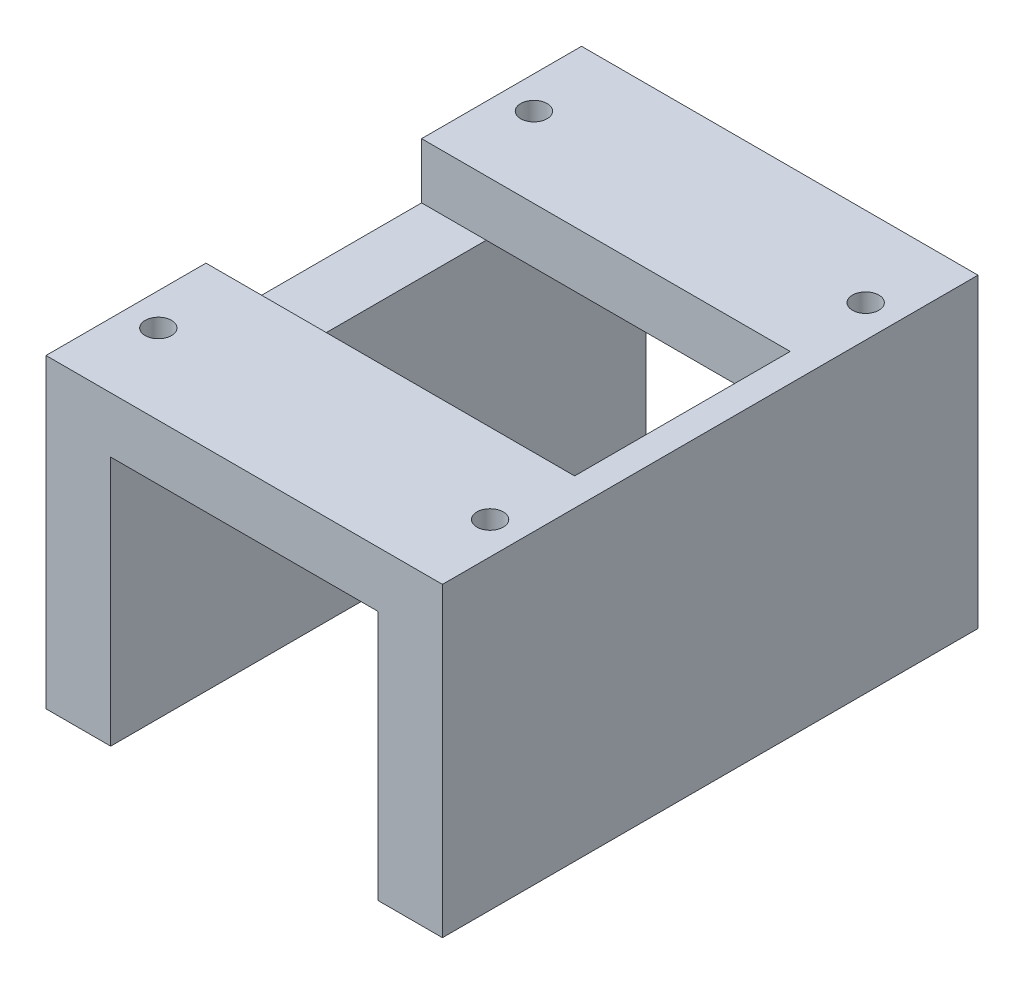
ISO-10303-21;
HEADER;
FILE_DESCRIPTION(('STEP AP214'),'2;1');
FILE_NAME('part.step','',(''),(''),'','','');
FILE_SCHEMA(('AUTOMOTIVE_DESIGN { 1 0 10303 214 1 1 1 1 }'));
ENDSEC;
DATA;
#1=APPLICATION_CONTEXT('core data for automotive mechanical design processes');
#2=APPLICATION_PROTOCOL_DEFINITION('international standard','automotive_design',2000,#1);
#3=PRODUCT_CONTEXT('',#1,'mechanical');
#4=PRODUCT('Part','Part','',(#3));
#5=PRODUCT_RELATED_PRODUCT_CATEGORY('part','',(#4));
#6=PRODUCT_DEFINITION_FORMATION('','',#4);
#7=PRODUCT_DEFINITION_CONTEXT('part definition',#1,'design');
#8=PRODUCT_DEFINITION('design','',#6,#7);
#9=PRODUCT_DEFINITION_SHAPE('','',#8);
#10=(LENGTH_UNIT() NAMED_UNIT(*) SI_UNIT(.MILLI.,.METRE.));
#11=(NAMED_UNIT(*) PLANE_ANGLE_UNIT() SI_UNIT($,.RADIAN.));
#12=(NAMED_UNIT(*) SI_UNIT($,.STERADIAN.) SOLID_ANGLE_UNIT());
#13=UNCERTAINTY_MEASURE_WITH_UNIT(LENGTH_MEASURE(1.E-05),#10,'distance_accuracy_value','');
#14=(GEOMETRIC_REPRESENTATION_CONTEXT(3) GLOBAL_UNCERTAINTY_ASSIGNED_CONTEXT((#13)) GLOBAL_UNIT_ASSIGNED_CONTEXT((#10,
#11,#12)) REPRESENTATION_CONTEXT('',''));
#15=CARTESIAN_POINT('',(0.,0.,0.));
#16=DIRECTION('',(0.,0.,1.));
#17=DIRECTION('',(1.,0.,0.));
#18=AXIS2_PLACEMENT_3D('',#15,#16,#17);
#19=CARTESIAN_POINT('',(-19.2,36.,-28.5));
#20=DIRECTION('',(0.,1.,0.));
#21=DIRECTION('',(0.,0.,1.));
#22=AXIS2_PLACEMENT_3D('',#19,#20,#21);
#23=PLANE('',#22);
#24=DIRECTION('',(0.,0.,1.));
#25=VECTOR('',#24,1.);
#26=CARTESIAN_POINT('',(19.2,36.,-28.5));
#27=LINE('',#26,#25);
#28=CARTESIAN_POINT('',(19.2,36.,-38.5));
#29=VERTEX_POINT('',#28);
#30=CARTESIAN_POINT('',(19.2,36.,-15.5));
#31=VERTEX_POINT('',#30);
#32=EDGE_CURVE('E251',#29,#31,#27,.T.);
#33=ORIENTED_EDGE('',*,*,#32,.T.);
#34=DIRECTION('',(-1.,0.,0.));
#35=VECTOR('',#34,1.);
#36=CARTESIAN_POINT('',(-28.5,36.,-15.5));
#37=LINE('',#36,#35);
#38=CARTESIAN_POINT('',(-19.2,36.,-15.5));
#39=VERTEX_POINT('',#38);
#40=EDGE_CURVE('E165',#31,#39,#37,.T.);
#41=ORIENTED_EDGE('',*,*,#40,.T.);
#42=DIRECTION('',(0.,0.,1.));
#43=VECTOR('',#42,1.);
#44=CARTESIAN_POINT('',(-19.2,36.,-28.5));
#45=LINE('',#44,#43);
#46=CARTESIAN_POINT('',(-19.2,36.,-38.5));
#47=VERTEX_POINT('',#46);
#48=EDGE_CURVE('E246',#47,#39,#45,.T.);
#49=ORIENTED_EDGE('',*,*,#48,.F.);
#50=DIRECTION('',(-1.,0.,0.));
#51=VECTOR('',#50,1.);
#52=CARTESIAN_POINT('',(19.2,36.,-38.5));
#53=LINE('',#52,#51);
#54=EDGE_CURVE('E200',#29,#47,#53,.T.);
#55=ORIENTED_EDGE('',*,*,#54,.F.);
#56=EDGE_LOOP('',(#33,#41,#49,#55));
#57=FACE_BOUND('',#56,.T.);
#58=ADVANCED_FACE('F36',(#57),#23,.F.);
#59=CARTESIAN_POINT('',(0.,0.,0.));
#60=DIRECTION('',(0.,1.,0.));
#61=DIRECTION('',(0.,0.,1.));
#62=AXIS2_PLACEMENT_3D('',#59,#60,#61);
#63=PLANE('',#62);
#64=CARTESIAN_POINT('',(-23.5,0.,9.50000000000001));
#65=DIRECTION('',(0.,-1.,0.));
#66=DIRECTION('',(0.,0.,-1.));
#67=AXIS2_PLACEMENT_3D('',#64,#65,#66);
#68=CIRCLE('',#67,1.9);
#69=CARTESIAN_POINT('',(-23.5,0.,7.60000000000001));
#70=VERTEX_POINT('',#69);
#71=EDGE_CURVE('E235',#70,#70,#68,.T.);
#72=ORIENTED_EDGE('',*,*,#71,.F.);
#73=EDGE_LOOP('',(#72));
#74=FACE_BOUND('',#73,.T.);
#75=CARTESIAN_POINT('',(-23.5,0.,-8.49999999999999));
#76=DIRECTION('',(0.,-1.,0.));
#77=DIRECTION('',(0.,0.,-1.));
#78=AXIS2_PLACEMENT_3D('',#75,#76,#77);
#79=CIRCLE('',#78,1.9);
#80=CARTESIAN_POINT('',(-23.5,0.,-10.4));
#81=VERTEX_POINT('',#80);
#82=EDGE_CURVE('E222',#81,#81,#79,.T.);
#83=ORIENTED_EDGE('',*,*,#82,.F.);
#84=EDGE_LOOP('',(#83));
#85=FACE_BOUND('',#84,.T.);
#86=DIRECTION('',(0.,0.,1.));
#87=VECTOR('',#86,1.);
#88=CARTESIAN_POINT('',(-28.5,0.,-18.5));
#89=LINE('',#88,#87);
#90=CARTESIAN_POINT('',(-28.5,0.,-38.5));
#91=VERTEX_POINT('',#90);
#92=CARTESIAN_POINT('',(-28.5,0.,38.5));
#93=VERTEX_POINT('',#92);
#94=EDGE_CURVE('E257',#91,#93,#89,.T.);
#95=ORIENTED_EDGE('',*,*,#94,.F.);
#96=DIRECTION('',(-1.,0.,0.));
#97=VECTOR('',#96,1.);
#98=CARTESIAN_POINT('',(-19.2,0.,-38.5));
#99=LINE('',#98,#97);
#100=CARTESIAN_POINT('',(-19.2,0.,-38.5));
#101=VERTEX_POINT('',#100);
#102=EDGE_CURVE('E206',#101,#91,#99,.T.);
#103=ORIENTED_EDGE('',*,*,#102,.F.);
#104=DIRECTION('',(0.,0.,1.));
#105=VECTOR('',#104,1.);
#106=CARTESIAN_POINT('',(-19.2,0.,0.));
#107=LINE('',#106,#105);
#108=CARTESIAN_POINT('',(-19.2,0.,38.5));
#109=VERTEX_POINT('',#108);
#110=EDGE_CURVE('E11',#101,#109,#107,.T.);
#111=ORIENTED_EDGE('',*,*,#110,.T.);
#112=DIRECTION('',(1.,0.,0.));
#113=VECTOR('',#112,1.);
#114=CARTESIAN_POINT('',(-28.5,0.,38.5));
#115=LINE('',#114,#113);
#116=EDGE_CURVE('E176',#93,#109,#115,.T.);
#117=ORIENTED_EDGE('',*,*,#116,.F.);
#118=EDGE_LOOP('',(#95,#103,#111,#117));
#119=FACE_BOUND('',#118,.T.);
#120=ADVANCED_FACE('F285',(#74,#85,#119),#63,.F.);
#121=CARTESIAN_POINT('',(28.5,44.,-18.5));
#122=DIRECTION('',(-1.,0.,0.));
#123=DIRECTION('',(0.,0.,1.));
#124=AXIS2_PLACEMENT_3D('',#121,#122,#123);
#125=PLANE('',#124);
#126=DIRECTION('',(0.,0.,-1.));
#127=VECTOR('',#126,1.);
#128=CARTESIAN_POINT('',(28.5,0.,-18.5));
#129=LINE('',#128,#127);
#130=CARTESIAN_POINT('',(28.5,0.,38.5));
#131=VERTEX_POINT('',#130);
#132=CARTESIAN_POINT('',(28.5,0.,-38.5));
#133=VERTEX_POINT('',#132);
#134=EDGE_CURVE('E249',#131,#133,#129,.T.);
#135=ORIENTED_EDGE('',*,*,#134,.T.);
#136=DIRECTION('',(0.,-1.,0.));
#137=VECTOR('',#136,1.);
#138=CARTESIAN_POINT('',(28.5,44.,-38.5));
#139=LINE('',#138,#137);
#140=CARTESIAN_POINT('',(28.5,44.,-38.5));
#141=VERTEX_POINT('',#140);
#142=EDGE_CURVE('E215',#141,#133,#139,.T.);
#143=ORIENTED_EDGE('',*,*,#142,.F.);
#144=DIRECTION('',(0.,0.,-1.));
#145=VECTOR('',#144,1.);
#146=CARTESIAN_POINT('',(28.5,44.,-18.5));
#147=LINE('',#146,#145);
#148=CARTESIAN_POINT('',(28.5,44.,38.5));
#149=VERTEX_POINT('',#148);
#150=EDGE_CURVE('E255',#149,#141,#147,.T.);
#151=ORIENTED_EDGE('',*,*,#150,.F.);
#152=DIRECTION('',(0.,1.,0.));
#153=VECTOR('',#152,1.);
#154=CARTESIAN_POINT('',(28.5,0.,38.5));
#155=LINE('',#154,#153);
#156=EDGE_CURVE('E191',#131,#149,#155,.T.);
#157=ORIENTED_EDGE('',*,*,#156,.F.);
#158=EDGE_LOOP('',(#135,#143,#151,#157));
#159=FACE_BOUND('',#158,.T.);
#160=ADVANCED_FACE('F38',(#159),#125,.F.);
#161=CARTESIAN_POINT('',(-28.5,44.,-18.5));
#162=DIRECTION('',(1.,0.,0.));
#163=DIRECTION('',(0.,0.,-1.));
#164=AXIS2_PLACEMENT_3D('',#161,#162,#163);
#165=PLANE('',#164);
#166=DIRECTION('',(0.,0.,1.));
#167=VECTOR('',#166,1.);
#168=CARTESIAN_POINT('',(-28.5,36.,15.5));
#169=LINE('',#168,#167);
#170=CARTESIAN_POINT('',(-28.5,36.,-15.5));
#171=VERTEX_POINT('',#170);
#172=CARTESIAN_POINT('',(-28.5,36.,15.5));
#173=VERTEX_POINT('',#172);
#174=EDGE_CURVE('E148',#171,#173,#169,.T.);
#175=ORIENTED_EDGE('',*,*,#174,.F.);
#176=DIRECTION('',(0.,1.,0.));
#177=VECTOR('',#176,1.);
#178=CARTESIAN_POINT('',(-28.5,36.,-15.5));
#179=LINE('',#178,#177);
#180=CARTESIAN_POINT('',(-28.5,44.,-15.5));
#181=VERTEX_POINT('',#180);
#182=EDGE_CURVE('E173',#171,#181,#179,.T.);
#183=ORIENTED_EDGE('',*,*,#182,.T.);
#184=DIRECTION('',(0.,0.,1.));
#185=VECTOR('',#184,1.);
#186=CARTESIAN_POINT('',(-28.5,44.,-18.5));
#187=LINE('',#186,#185);
#188=CARTESIAN_POINT('',(-28.5,44.,-38.5));
#189=VERTEX_POINT('',#188);
#190=EDGE_CURVE('E258',#189,#181,#187,.T.);
#191=ORIENTED_EDGE('',*,*,#190,.F.);
#192=DIRECTION('',(0.,1.,0.));
#193=VECTOR('',#192,1.);
#194=CARTESIAN_POINT('',(-28.5,0.,-38.5));
#195=LINE('',#194,#193);
#196=EDGE_CURVE('E209',#91,#189,#195,.T.);
#197=ORIENTED_EDGE('',*,*,#196,.F.);
#198=ORIENTED_EDGE('',*,*,#94,.T.);
#199=DIRECTION('',(0.,-1.,0.));
#200=VECTOR('',#199,1.);
#201=CARTESIAN_POINT('',(-28.5,44.,38.5));
#202=LINE('',#201,#200);
#203=CARTESIAN_POINT('',(-28.5,44.,38.5));
#204=VERTEX_POINT('',#203);
#205=EDGE_CURVE('E172',#204,#93,#202,.T.);
#206=ORIENTED_EDGE('',*,*,#205,.F.);
#207=CARTESIAN_POINT('',(-28.5,44.,15.5));
#208=VERTEX_POINT('',#207);
#209=EDGE_CURVE('E160',#208,#204,#187,.T.);
#210=ORIENTED_EDGE('',*,*,#209,.F.);
#211=DIRECTION('',(0.,1.,0.));
#212=VECTOR('',#211,1.);
#213=CARTESIAN_POINT('',(-28.5,36.,15.5));
#214=LINE('',#213,#212);
#215=EDGE_CURVE('E51',#173,#208,#214,.T.);
#216=ORIENTED_EDGE('',*,*,#215,.F.);
#217=EDGE_LOOP('',(#175,#183,#191,#197,#198,#206,#210,#216));
#218=FACE_BOUND('',#217,.T.);
#219=ADVANCED_FACE('F158',(#218),#165,.F.);
#220=CARTESIAN_POINT('',(0.,44.,0.));
#221=DIRECTION('',(0.,1.,0.));
#222=DIRECTION('',(0.,0.,1.));
#223=AXIS2_PLACEMENT_3D('',#220,#221,#222);
#224=PLANE('',#223);
#225=CARTESIAN_POINT('',(23.85,44.,-27.));
#226=DIRECTION('',(0.,1.,0.));
#227=DIRECTION('',(0.,0.,1.));
#228=AXIS2_PLACEMENT_3D('',#225,#226,#227);
#229=CIRCLE('',#228,1.9);
#230=CARTESIAN_POINT('',(23.85,44.,-25.1));
#231=VERTEX_POINT('',#230);
#232=EDGE_CURVE('E738',#231,#231,#229,.T.);
#233=ORIENTED_EDGE('',*,*,#232,.F.);
#234=EDGE_LOOP('',(#233));
#235=FACE_BOUND('',#234,.T.);
#236=CARTESIAN_POINT('',(-23.85,44.,-27.));
#237=DIRECTION('',(0.,1.,0.));
#238=DIRECTION('',(0.,0.,1.));
#239=AXIS2_PLACEMENT_3D('',#236,#237,#238);
#240=CIRCLE('',#239,1.9);
#241=CARTESIAN_POINT('',(-23.85,44.,-25.1));
#242=VERTEX_POINT('',#241);
#243=EDGE_CURVE('E737',#242,#242,#240,.T.);
#244=ORIENTED_EDGE('',*,*,#243,.F.);
#245=EDGE_LOOP('',(#244));
#246=FACE_BOUND('',#245,.T.);
#247=CARTESIAN_POINT('',(-23.85,44.,27.));
#248=DIRECTION('',(0.,1.,0.));
#249=DIRECTION('',(0.,0.,1.));
#250=AXIS2_PLACEMENT_3D('',#247,#248,#249);
#251=CIRCLE('',#250,1.9);
#252=CARTESIAN_POINT('',(-23.85,44.,28.9));
#253=VERTEX_POINT('',#252);
#254=EDGE_CURVE('E754',#253,#253,#251,.T.);
#255=ORIENTED_EDGE('',*,*,#254,.F.);
#256=EDGE_LOOP('',(#255));
#257=FACE_BOUND('',#256,.T.);
#258=CARTESIAN_POINT('',(23.85,44.,27.));
#259=DIRECTION('',(0.,1.,0.));
#260=DIRECTION('',(0.,0.,1.));
#261=AXIS2_PLACEMENT_3D('',#258,#259,#260);
#262=CIRCLE('',#261,1.9);
#263=CARTESIAN_POINT('',(23.85,44.,28.9));
#264=VERTEX_POINT('',#263);
#265=EDGE_CURVE('E748',#264,#264,#262,.T.);
#266=ORIENTED_EDGE('',*,*,#265,.F.);
#267=EDGE_LOOP('',(#266));
#268=FACE_BOUND('',#267,.T.);
#269=DIRECTION('',(-1.,0.,0.));
#270=VECTOR('',#269,1.);
#271=CARTESIAN_POINT('',(-28.5,44.,-15.5));
#272=LINE('',#271,#270);
#273=CARTESIAN_POINT('',(24.5,44.,-15.5));
#274=VERTEX_POINT('',#273);
#275=EDGE_CURVE('E155',#274,#181,#272,.T.);
#276=ORIENTED_EDGE('',*,*,#275,.F.);
#277=DIRECTION('',(0.,0.,-1.));
#278=VECTOR('',#277,1.);
#279=CARTESIAN_POINT('',(24.5,44.,-15.5));
#280=LINE('',#279,#278);
#281=CARTESIAN_POINT('',(24.5,44.,15.5));
#282=VERTEX_POINT('',#281);
#283=EDGE_CURVE('E307',#282,#274,#280,.T.);
#284=ORIENTED_EDGE('',*,*,#283,.F.);
#285=DIRECTION('',(1.,0.,0.));
#286=VECTOR('',#285,1.);
#287=CARTESIAN_POINT('',(24.5,44.,15.5));
#288=LINE('',#287,#286);
#289=EDGE_CURVE('E305',#208,#282,#288,.T.);
#290=ORIENTED_EDGE('',*,*,#289,.F.);
#291=ORIENTED_EDGE('',*,*,#209,.T.);
#292=DIRECTION('',(-1.,0.,0.));
#293=VECTOR('',#292,1.);
#294=CARTESIAN_POINT('',(28.5,44.,38.5));
#295=LINE('',#294,#293);
#296=EDGE_CURVE('E194',#149,#204,#295,.T.);
#297=ORIENTED_EDGE('',*,*,#296,.F.);
#298=ORIENTED_EDGE('',*,*,#150,.T.);
#299=DIRECTION('',(1.,0.,0.));
#300=VECTOR('',#299,1.);
#301=CARTESIAN_POINT('',(-28.5,44.,-38.5));
#302=LINE('',#301,#300);
#303=EDGE_CURVE('E212',#189,#141,#302,.T.);
#304=ORIENTED_EDGE('',*,*,#303,.F.);
#305=ORIENTED_EDGE('',*,*,#190,.T.);
#306=EDGE_LOOP('',(#276,#284,#290,#291,#297,#298,#304,#305));
#307=FACE_BOUND('',#306,.T.);
#308=ADVANCED_FACE('F294',(#235,#246,#257,#268,#307),#224,.T.);
#309=CARTESIAN_POINT('',(23.7048064487137,0.,-8.5));
#310=DIRECTION('',(0.,-1.,0.));
#311=DIRECTION('',(0.,0.,-1.));
#312=AXIS2_PLACEMENT_3D('',#309,#310,#311);
#313=CIRCLE('',#312,1.9);
#314=CARTESIAN_POINT('',(23.7048064487137,0.,-10.4));
#315=VERTEX_POINT('',#314);
#316=EDGE_CURVE('E228',#315,#315,#313,.T.);
#317=ORIENTED_EDGE('',*,*,#316,.F.);
#318=EDGE_LOOP('',(#317));
#319=FACE_BOUND('',#318,.T.);
#320=CARTESIAN_POINT('',(23.7048064487137,0.,9.49999999999999));
#321=DIRECTION('',(0.,-1.,0.));
#322=DIRECTION('',(0.,0.,-1.));
#323=AXIS2_PLACEMENT_3D('',#320,#321,#322);
#324=CIRCLE('',#323,1.9);
#325=CARTESIAN_POINT('',(23.7048064487137,0.,7.6));
#326=VERTEX_POINT('',#325);
#327=EDGE_CURVE('E231',#326,#326,#324,.T.);
#328=ORIENTED_EDGE('',*,*,#327,.F.);
#329=EDGE_LOOP('',(#328));
#330=FACE_BOUND('',#329,.T.);
#331=ORIENTED_EDGE('',*,*,#134,.F.);
#332=DIRECTION('',(1.,0.,0.));
#333=VECTOR('',#332,1.);
#334=CARTESIAN_POINT('',(19.2,0.,38.5));
#335=LINE('',#334,#333);
#336=CARTESIAN_POINT('',(19.2,0.,38.5));
#337=VERTEX_POINT('',#336);
#338=EDGE_CURVE('E188',#337,#131,#335,.T.);
#339=ORIENTED_EDGE('',*,*,#338,.F.);
#340=DIRECTION('',(0.,0.,-1.));
#341=VECTOR('',#340,1.);
#342=CARTESIAN_POINT('',(19.2,0.,0.));
#343=LINE('',#342,#341);
#344=CARTESIAN_POINT('',(19.2,0.,-38.5));
#345=VERTEX_POINT('',#344);
#346=EDGE_CURVE('E44',#337,#345,#343,.T.);
#347=ORIENTED_EDGE('',*,*,#346,.T.);
#348=DIRECTION('',(-1.,0.,0.));
#349=VECTOR('',#348,1.);
#350=CARTESIAN_POINT('',(28.5,0.,-38.5));
#351=LINE('',#350,#349);
#352=EDGE_CURVE('E218',#133,#345,#351,.T.);
#353=ORIENTED_EDGE('',*,*,#352,.F.);
#354=EDGE_LOOP('',(#331,#339,#347,#353));
#355=FACE_BOUND('',#354,.T.);
#356=ADVANCED_FACE('F265',(#319,#330,#355),#63,.F.);
#357=CARTESIAN_POINT('',(-19.2,36.,15.5));
#358=VERTEX_POINT('',#357);
#359=CARTESIAN_POINT('',(-19.2,36.,38.5));
#360=VERTEX_POINT('',#359);
#361=EDGE_CURVE('E250',#358,#360,#45,.T.);
#362=ORIENTED_EDGE('',*,*,#361,.F.);
#363=DIRECTION('',(1.,0.,0.));
#364=VECTOR('',#363,1.);
#365=CARTESIAN_POINT('',(24.5,36.,15.5));
#366=LINE('',#365,#364);
#367=CARTESIAN_POINT('',(19.2,36.,15.5));
#368=VERTEX_POINT('',#367);
#369=EDGE_CURVE('E141',#358,#368,#366,.T.);
#370=ORIENTED_EDGE('',*,*,#369,.T.);
#371=CARTESIAN_POINT('',(19.2,36.,38.5));
#372=VERTEX_POINT('',#371);
#373=EDGE_CURVE('E243',#368,#372,#27,.T.);
#374=ORIENTED_EDGE('',*,*,#373,.T.);
#375=DIRECTION('',(1.,0.,0.));
#376=VECTOR('',#375,1.);
#377=CARTESIAN_POINT('',(-19.2,36.,38.5));
#378=LINE('',#377,#376);
#379=EDGE_CURVE('E182',#360,#372,#378,.T.);
#380=ORIENTED_EDGE('',*,*,#379,.F.);
#381=EDGE_LOOP('',(#362,#370,#374,#380));
#382=FACE_BOUND('',#381,.T.);
#383=ADVANCED_FACE('F301',(#382),#23,.F.);
#384=CARTESIAN_POINT('',(-19.2,0.,-28.5));
#385=DIRECTION('',(-1.,0.,0.));
#386=DIRECTION('',(0.,0.,1.));
#387=AXIS2_PLACEMENT_3D('',#384,#385,#386);
#388=PLANE('',#387);
#389=ORIENTED_EDGE('',*,*,#48,.T.);
#390=DIRECTION('',(0.,0.,1.));
#391=VECTOR('',#390,1.);
#392=CARTESIAN_POINT('',(-19.2,36.,-28.5));
#393=LINE('',#392,#391);
#394=EDGE_CURVE('E169',#39,#358,#393,.T.);
#395=ORIENTED_EDGE('',*,*,#394,.T.);
#396=ORIENTED_EDGE('',*,*,#361,.T.);
#397=DIRECTION('',(0.,1.,0.));
#398=VECTOR('',#397,1.);
#399=CARTESIAN_POINT('',(-19.2,0.,38.5));
#400=LINE('',#399,#398);
#401=EDGE_CURVE('E179',#109,#360,#400,.T.);
#402=ORIENTED_EDGE('',*,*,#401,.F.);
#403=ORIENTED_EDGE('',*,*,#110,.F.);
#404=DIRECTION('',(0.,-1.,0.));
#405=VECTOR('',#404,1.);
#406=CARTESIAN_POINT('',(-19.2,36.,-38.5));
#407=LINE('',#406,#405);
#408=EDGE_CURVE('E203',#47,#101,#407,.T.);
#409=ORIENTED_EDGE('',*,*,#408,.F.);
#410=EDGE_LOOP('',(#389,#395,#396,#402,#403,#409));
#411=FACE_BOUND('',#410,.T.);
#412=ADVANCED_FACE('F281',(#411),#388,.F.);
#413=CARTESIAN_POINT('',(19.2,36.,-28.5));
#414=DIRECTION('',(1.,0.,0.));
#415=DIRECTION('',(0.,1.,0.));
#416=AXIS2_PLACEMENT_3D('',#413,#414,#415);
#417=PLANE('',#416);
#418=ORIENTED_EDGE('',*,*,#346,.F.);
#419=DIRECTION('',(0.,-1.,0.));
#420=VECTOR('',#419,1.);
#421=CARTESIAN_POINT('',(19.2,36.,38.5));
#422=LINE('',#421,#420);
#423=EDGE_CURVE('E185',#372,#337,#422,.T.);
#424=ORIENTED_EDGE('',*,*,#423,.F.);
#425=ORIENTED_EDGE('',*,*,#373,.F.);
#426=EDGE_CURVE('E254',#31,#368,#27,.T.);
#427=ORIENTED_EDGE('',*,*,#426,.F.);
#428=ORIENTED_EDGE('',*,*,#32,.F.);
#429=DIRECTION('',(0.,1.,0.));
#430=VECTOR('',#429,1.);
#431=CARTESIAN_POINT('',(19.2,0.,-38.5));
#432=LINE('',#431,#430);
#433=EDGE_CURVE('E197',#345,#29,#432,.T.);
#434=ORIENTED_EDGE('',*,*,#433,.F.);
#435=EDGE_LOOP('',(#418,#424,#425,#427,#428,#434));
#436=FACE_BOUND('',#435,.T.);
#437=ADVANCED_FACE('F272',(#436),#417,.F.);
#438=CARTESIAN_POINT('',(23.7048064487137,30.,9.49999999999999));
#439=DIRECTION('',(0.,-1.,0.));
#440=DIRECTION('',(0.,0.,-1.));
#441=AXIS2_PLACEMENT_3D('',#438,#439,#440);
#442=CYLINDRICAL_SURFACE('',#441,1.9);
#443=CARTESIAN_POINT('',(23.7048064487137,30.,9.49999999999999));
#444=DIRECTION('',(0.,-1.,0.));
#445=DIRECTION('',(0.,0.,-1.));
#446=AXIS2_PLACEMENT_3D('',#443,#444,#445);
#447=CIRCLE('',#446,1.9);
#448=CARTESIAN_POINT('',(23.7048064487137,30.,7.6));
#449=VERTEX_POINT('',#448);
#450=EDGE_CURVE('E240',#449,#449,#447,.T.);
#451=ORIENTED_EDGE('',*,*,#450,.F.);
#452=EDGE_LOOP('',(#451));
#453=FACE_BOUND('',#452,.T.);
#454=ORIENTED_EDGE('',*,*,#327,.T.);
#455=EDGE_LOOP('',(#454));
#456=FACE_BOUND('',#455,.T.);
#457=ADVANCED_FACE('F591',(#453,#456),#442,.F.);
#458=CARTESIAN_POINT('',(23.7048064487137,30.,9.49999999999999));
#459=DIRECTION('',(0.,-1.,0.));
#460=DIRECTION('',(0.,0.,-1.));
#461=AXIS2_PLACEMENT_3D('',#458,#459,#460);
#462=PLANE('',#461);
#463=ORIENTED_EDGE('',*,*,#450,.T.);
#464=EDGE_LOOP('',(#463));
#465=FACE_BOUND('',#464,.T.);
#466=ADVANCED_FACE('F581',(#465),#462,.T.);
#467=CARTESIAN_POINT('',(23.7048064487137,30.,-8.5));
#468=DIRECTION('',(0.,-1.,0.));
#469=DIRECTION('',(0.,0.,-1.));
#470=AXIS2_PLACEMENT_3D('',#467,#468,#469);
#471=CYLINDRICAL_SURFACE('',#470,1.9);
#472=CARTESIAN_POINT('',(23.7048064487137,30.,-8.5));
#473=DIRECTION('',(0.,-1.,0.));
#474=DIRECTION('',(0.,0.,-1.));
#475=AXIS2_PLACEMENT_3D('',#472,#473,#474);
#476=CIRCLE('',#475,1.9);
#477=CARTESIAN_POINT('',(23.7048064487137,30.,-10.4));
#478=VERTEX_POINT('',#477);
#479=EDGE_CURVE('E232',#478,#478,#476,.T.);
#480=ORIENTED_EDGE('',*,*,#479,.F.);
#481=EDGE_LOOP('',(#480));
#482=FACE_BOUND('',#481,.T.);
#483=ORIENTED_EDGE('',*,*,#316,.T.);
#484=EDGE_LOOP('',(#483));
#485=FACE_BOUND('',#484,.T.);
#486=ADVANCED_FACE('F571',(#482,#485),#471,.F.);
#487=CARTESIAN_POINT('',(23.7048064487137,30.,-8.5));
#488=DIRECTION('',(0.,-1.,0.));
#489=DIRECTION('',(0.,0.,-1.));
#490=AXIS2_PLACEMENT_3D('',#487,#488,#489);
#491=PLANE('',#490);
#492=ORIENTED_EDGE('',*,*,#479,.T.);
#493=EDGE_LOOP('',(#492));
#494=FACE_BOUND('',#493,.T.);
#495=ADVANCED_FACE('F561',(#494),#491,.T.);
#496=CARTESIAN_POINT('',(-23.5,30.,-8.49999999999999));
#497=DIRECTION('',(0.,-1.,0.));
#498=DIRECTION('',(0.,0.,-1.));
#499=AXIS2_PLACEMENT_3D('',#496,#497,#498);
#500=CYLINDRICAL_SURFACE('',#499,1.9);
#501=CARTESIAN_POINT('',(-23.5,30.,-8.49999999999999));
#502=DIRECTION('',(0.,-1.,0.));
#503=DIRECTION('',(0.,0.,-1.));
#504=AXIS2_PLACEMENT_3D('',#501,#502,#503);
#505=CIRCLE('',#504,1.9);
#506=CARTESIAN_POINT('',(-23.5,30.,-10.4));
#507=VERTEX_POINT('',#506);
#508=EDGE_CURVE('E221',#507,#507,#505,.T.);
#509=ORIENTED_EDGE('',*,*,#508,.F.);
#510=EDGE_LOOP('',(#509));
#511=FACE_BOUND('',#510,.T.);
#512=ORIENTED_EDGE('',*,*,#82,.T.);
#513=EDGE_LOOP('',(#512));
#514=FACE_BOUND('',#513,.T.);
#515=ADVANCED_FACE('F551',(#511,#514),#500,.F.);
#516=CARTESIAN_POINT('',(-23.5,30.,-8.49999999999999));
#517=DIRECTION('',(0.,-1.,0.));
#518=DIRECTION('',(0.,0.,-1.));
#519=AXIS2_PLACEMENT_3D('',#516,#517,#518);
#520=PLANE('',#519);
#521=ORIENTED_EDGE('',*,*,#508,.T.);
#522=EDGE_LOOP('',(#521));
#523=FACE_BOUND('',#522,.T.);
#524=ADVANCED_FACE('F541',(#523),#520,.T.);
#525=CARTESIAN_POINT('',(-23.5,30.,9.50000000000001));
#526=DIRECTION('',(0.,-1.,0.));
#527=DIRECTION('',(0.,0.,-1.));
#528=AXIS2_PLACEMENT_3D('',#525,#526,#527);
#529=CYLINDRICAL_SURFACE('',#528,1.9);
#530=CARTESIAN_POINT('',(-23.5,30.,9.50000000000001));
#531=DIRECTION('',(0.,-1.,0.));
#532=DIRECTION('',(0.,0.,-1.));
#533=AXIS2_PLACEMENT_3D('',#530,#531,#532);
#534=CIRCLE('',#533,1.9);
#535=CARTESIAN_POINT('',(-23.5,30.,7.60000000000001));
#536=VERTEX_POINT('',#535);
#537=EDGE_CURVE('E225',#536,#536,#534,.T.);
#538=ORIENTED_EDGE('',*,*,#537,.F.);
#539=EDGE_LOOP('',(#538));
#540=FACE_BOUND('',#539,.T.);
#541=ORIENTED_EDGE('',*,*,#71,.T.);
#542=EDGE_LOOP('',(#541));
#543=FACE_BOUND('',#542,.T.);
#544=ADVANCED_FACE('F530',(#540,#543),#529,.F.);
#545=CARTESIAN_POINT('',(-23.5,30.,9.50000000000001));
#546=DIRECTION('',(0.,-1.,0.));
#547=DIRECTION('',(0.,0.,-1.));
#548=AXIS2_PLACEMENT_3D('',#545,#546,#547);
#549=PLANE('',#548);
#550=ORIENTED_EDGE('',*,*,#537,.T.);
#551=EDGE_LOOP('',(#550));
#552=FACE_BOUND('',#551,.T.);
#553=ADVANCED_FACE('F519',(#552),#549,.T.);
#554=CARTESIAN_POINT('',(0.,0.,-38.5));
#555=DIRECTION('',(0.,0.,1.));
#556=DIRECTION('',(1.,0.,0.));
#557=AXIS2_PLACEMENT_3D('',#554,#555,#556);
#558=PLANE('',#557);
#559=ORIENTED_EDGE('',*,*,#433,.T.);
#560=ORIENTED_EDGE('',*,*,#54,.T.);
#561=ORIENTED_EDGE('',*,*,#408,.T.);
#562=ORIENTED_EDGE('',*,*,#102,.T.);
#563=ORIENTED_EDGE('',*,*,#196,.T.);
#564=ORIENTED_EDGE('',*,*,#303,.T.);
#565=ORIENTED_EDGE('',*,*,#142,.T.);
#566=ORIENTED_EDGE('',*,*,#352,.T.);
#567=EDGE_LOOP('',(#559,#560,#561,#562,#563,#564,#565,#566));
#568=FACE_BOUND('',#567,.T.);
#569=ADVANCED_FACE('F270',(#568),#558,.F.);
#570=CARTESIAN_POINT('',(0.,0.,38.5));
#571=DIRECTION('',(0.,0.,1.));
#572=DIRECTION('',(1.,0.,0.));
#573=AXIS2_PLACEMENT_3D('',#570,#571,#572);
#574=PLANE('',#573);
#575=ORIENTED_EDGE('',*,*,#205,.T.);
#576=ORIENTED_EDGE('',*,*,#116,.T.);
#577=ORIENTED_EDGE('',*,*,#401,.T.);
#578=ORIENTED_EDGE('',*,*,#379,.T.);
#579=ORIENTED_EDGE('',*,*,#423,.T.);
#580=ORIENTED_EDGE('',*,*,#338,.T.);
#581=ORIENTED_EDGE('',*,*,#156,.T.);
#582=ORIENTED_EDGE('',*,*,#296,.T.);
#583=EDGE_LOOP('',(#575,#576,#577,#578,#579,#580,#581,#582));
#584=FACE_BOUND('',#583,.T.);
#585=ADVANCED_FACE('F287',(#584),#574,.T.);
#586=CARTESIAN_POINT('',(0.,36.,0.));
#587=DIRECTION('',(0.,-1.,0.));
#588=DIRECTION('',(0.,0.,-1.));
#589=AXIS2_PLACEMENT_3D('',#586,#587,#588);
#590=PLANE('',#589);
#591=EDGE_CURVE('E151',#39,#171,#37,.T.);
#592=ORIENTED_EDGE('',*,*,#591,.T.);
#593=ORIENTED_EDGE('',*,*,#174,.T.);
#594=EDGE_CURVE('E136',#173,#358,#366,.T.);
#595=ORIENTED_EDGE('',*,*,#594,.T.);
#596=ORIENTED_EDGE('',*,*,#394,.F.);
#597=EDGE_LOOP('',(#592,#593,#595,#596));
#598=FACE_BOUND('',#597,.T.);
#599=ADVANCED_FACE('F149',(#598),#590,.F.);
#600=CARTESIAN_POINT('',(24.5,36.,15.5));
#601=VERTEX_POINT('',#600);
#602=EDGE_CURVE('E146',#368,#601,#366,.T.);
#603=ORIENTED_EDGE('',*,*,#602,.T.);
#604=DIRECTION('',(0.,0.,-1.));
#605=VECTOR('',#604,1.);
#606=CARTESIAN_POINT('',(24.5,36.,-15.5));
#607=LINE('',#606,#605);
#608=CARTESIAN_POINT('',(24.5,36.,-15.5));
#609=VERTEX_POINT('',#608);
#610=EDGE_CURVE('E144',#601,#609,#607,.T.);
#611=ORIENTED_EDGE('',*,*,#610,.T.);
#612=EDGE_CURVE('E59',#609,#31,#37,.T.);
#613=ORIENTED_EDGE('',*,*,#612,.T.);
#614=ORIENTED_EDGE('',*,*,#426,.T.);
#615=EDGE_LOOP('',(#603,#611,#613,#614));
#616=FACE_BOUND('',#615,.T.);
#617=ADVANCED_FACE('F298',(#616),#590,.F.);
#618=CARTESIAN_POINT('',(-28.5,36.,-15.5));
#619=DIRECTION('',(0.,0.,-1.));
#620=DIRECTION('',(-1.,0.,0.));
#621=AXIS2_PLACEMENT_3D('',#618,#619,#620);
#622=PLANE('',#621);
#623=ORIENTED_EDGE('',*,*,#275,.T.);
#624=ORIENTED_EDGE('',*,*,#182,.F.);
#625=ORIENTED_EDGE('',*,*,#591,.F.);
#626=ORIENTED_EDGE('',*,*,#40,.F.);
#627=ORIENTED_EDGE('',*,*,#612,.F.);
#628=DIRECTION('',(0.,1.,0.));
#629=VECTOR('',#628,1.);
#630=CARTESIAN_POINT('',(24.5,36.,-15.5));
#631=LINE('',#630,#629);
#632=EDGE_CURVE('E163',#609,#274,#631,.T.);
#633=ORIENTED_EDGE('',*,*,#632,.T.);
#634=EDGE_LOOP('',(#623,#624,#625,#626,#627,#633));
#635=FACE_BOUND('',#634,.T.);
#636=ADVANCED_FACE('F313',(#635),#622,.F.);
#637=CARTESIAN_POINT('',(24.5,36.,-15.5));
#638=DIRECTION('',(1.,0.,0.));
#639=DIRECTION('',(0.,0.,-1.));
#640=AXIS2_PLACEMENT_3D('',#637,#638,#639);
#641=PLANE('',#640);
#642=ORIENTED_EDGE('',*,*,#283,.T.);
#643=ORIENTED_EDGE('',*,*,#632,.F.);
#644=ORIENTED_EDGE('',*,*,#610,.F.);
#645=DIRECTION('',(0.,1.,0.));
#646=VECTOR('',#645,1.);
#647=CARTESIAN_POINT('',(24.5,36.,15.5));
#648=LINE('',#647,#646);
#649=EDGE_CURVE('E161',#601,#282,#648,.T.);
#650=ORIENTED_EDGE('',*,*,#649,.T.);
#651=EDGE_LOOP('',(#642,#643,#644,#650));
#652=FACE_BOUND('',#651,.T.);
#653=ADVANCED_FACE('F316',(#652),#641,.F.);
#654=CARTESIAN_POINT('',(24.5,36.,15.5));
#655=DIRECTION('',(0.,0.,1.));
#656=DIRECTION('',(1.,0.,0.));
#657=AXIS2_PLACEMENT_3D('',#654,#655,#656);
#658=PLANE('',#657);
#659=ORIENTED_EDGE('',*,*,#289,.T.);
#660=ORIENTED_EDGE('',*,*,#649,.F.);
#661=ORIENTED_EDGE('',*,*,#602,.F.);
#662=ORIENTED_EDGE('',*,*,#369,.F.);
#663=ORIENTED_EDGE('',*,*,#594,.F.);
#664=ORIENTED_EDGE('',*,*,#215,.T.);
#665=EDGE_LOOP('',(#659,#660,#661,#662,#663,#664));
#666=FACE_BOUND('',#665,.T.);
#667=ADVANCED_FACE('F138',(#666),#658,.F.);
#668=CARTESIAN_POINT('',(23.85,19.,27.));
#669=DIRECTION('',(0.,1.,0.));
#670=DIRECTION('',(0.,0.,1.));
#671=AXIS2_PLACEMENT_3D('',#668,#669,#670);
#672=CYLINDRICAL_SURFACE('',#671,1.9);
#673=CARTESIAN_POINT('',(23.85,19.,27.));
#674=DIRECTION('',(0.,1.,0.));
#675=DIRECTION('',(0.,0.,1.));
#676=AXIS2_PLACEMENT_3D('',#673,#674,#675);
#677=CIRCLE('',#676,1.9);
#678=CARTESIAN_POINT('',(23.85,19.,28.9));
#679=VERTEX_POINT('',#678);
#680=EDGE_CURVE('E308',#679,#679,#677,.T.);
#681=ORIENTED_EDGE('',*,*,#680,.F.);
#682=EDGE_LOOP('',(#681));
#683=FACE_BOUND('',#682,.T.);
#684=ORIENTED_EDGE('',*,*,#265,.T.);
#685=EDGE_LOOP('',(#684));
#686=FACE_BOUND('',#685,.T.);
#687=ADVANCED_FACE('F323',(#683,#686),#672,.F.);
#688=CARTESIAN_POINT('',(0.,19.,0.));
#689=DIRECTION('',(0.,1.,0.));
#690=DIRECTION('',(0.,0.,1.));
#691=AXIS2_PLACEMENT_3D('',#688,#689,#690);
#692=PLANE('',#691);
#693=ORIENTED_EDGE('',*,*,#680,.T.);
#694=EDGE_LOOP('',(#693));
#695=FACE_BOUND('',#694,.T.);
#696=ADVANCED_FACE('F380',(#695),#692,.T.);
#697=CARTESIAN_POINT('',(-23.85,19.,27.));
#698=DIRECTION('',(0.,1.,0.));
#699=DIRECTION('',(0.,0.,1.));
#700=AXIS2_PLACEMENT_3D('',#697,#698,#699);
#701=CYLINDRICAL_SURFACE('',#700,1.9);
#702=CARTESIAN_POINT('',(-23.85,19.,27.));
#703=DIRECTION('',(0.,1.,0.));
#704=DIRECTION('',(0.,0.,1.));
#705=AXIS2_PLACEMENT_3D('',#702,#703,#704);
#706=CIRCLE('',#705,1.9);
#707=CARTESIAN_POINT('',(-23.85,19.,28.9));
#708=VERTEX_POINT('',#707);
#709=EDGE_CURVE('E750',#708,#708,#706,.T.);
#710=ORIENTED_EDGE('',*,*,#709,.F.);
#711=EDGE_LOOP('',(#710));
#712=FACE_BOUND('',#711,.T.);
#713=ORIENTED_EDGE('',*,*,#254,.T.);
#714=EDGE_LOOP('',(#713));
#715=FACE_BOUND('',#714,.T.);
#716=ADVANCED_FACE('F391',(#712,#715),#701,.F.);
#717=CARTESIAN_POINT('',(0.,19.,0.));
#718=DIRECTION('',(0.,1.,0.));
#719=DIRECTION('',(0.,0.,1.));
#720=AXIS2_PLACEMENT_3D('',#717,#718,#719);
#721=PLANE('',#720);
#722=ORIENTED_EDGE('',*,*,#709,.T.);
#723=EDGE_LOOP('',(#722));
#724=FACE_BOUND('',#723,.T.);
#725=ADVANCED_FACE('F402',(#724),#721,.T.);
#726=CARTESIAN_POINT('',(-23.85,19.,-27.));
#727=DIRECTION('',(0.,1.,0.));
#728=DIRECTION('',(0.,0.,1.));
#729=AXIS2_PLACEMENT_3D('',#726,#727,#728);
#730=CYLINDRICAL_SURFACE('',#729,1.9);
#731=CARTESIAN_POINT('',(-23.85,19.,-27.));
#732=DIRECTION('',(0.,1.,0.));
#733=DIRECTION('',(0.,0.,1.));
#734=AXIS2_PLACEMENT_3D('',#731,#732,#733);
#735=CIRCLE('',#734,1.9);
#736=CARTESIAN_POINT('',(-23.85,19.,-25.1));
#737=VERTEX_POINT('',#736);
#738=EDGE_CURVE('E741',#737,#737,#735,.T.);
#739=ORIENTED_EDGE('',*,*,#738,.F.);
#740=EDGE_LOOP('',(#739));
#741=FACE_BOUND('',#740,.T.);
#742=ORIENTED_EDGE('',*,*,#243,.T.);
#743=EDGE_LOOP('',(#742));
#744=FACE_BOUND('',#743,.T.);
#745=ADVANCED_FACE('F413',(#741,#744),#730,.F.);
#746=CARTESIAN_POINT('',(0.,19.,0.));
#747=DIRECTION('',(0.,1.,0.));
#748=DIRECTION('',(0.,0.,1.));
#749=AXIS2_PLACEMENT_3D('',#746,#747,#748);
#750=PLANE('',#749);
#751=ORIENTED_EDGE('',*,*,#738,.T.);
#752=EDGE_LOOP('',(#751));
#753=FACE_BOUND('',#752,.T.);
#754=ADVANCED_FACE('F424',(#753),#750,.T.);
#755=CARTESIAN_POINT('',(23.85,19.,-27.));
#756=DIRECTION('',(0.,1.,0.));
#757=DIRECTION('',(0.,0.,1.));
#758=AXIS2_PLACEMENT_3D('',#755,#756,#757);
#759=CYLINDRICAL_SURFACE('',#758,1.9);
#760=CARTESIAN_POINT('',(23.85,19.,-27.));
#761=DIRECTION('',(0.,1.,0.));
#762=DIRECTION('',(0.,0.,1.));
#763=AXIS2_PLACEMENT_3D('',#760,#761,#762);
#764=CIRCLE('',#763,1.9);
#765=CARTESIAN_POINT('',(23.85,19.,-25.1));
#766=VERTEX_POINT('',#765);
#767=EDGE_CURVE('E736',#766,#766,#764,.T.);
#768=ORIENTED_EDGE('',*,*,#767,.F.);
#769=EDGE_LOOP('',(#768));
#770=FACE_BOUND('',#769,.T.);
#771=ORIENTED_EDGE('',*,*,#232,.T.);
#772=EDGE_LOOP('',(#771));
#773=FACE_BOUND('',#772,.T.);
#774=ADVANCED_FACE('F435',(#770,#773),#759,.F.);
#775=CARTESIAN_POINT('',(0.,19.,0.));
#776=DIRECTION('',(0.,1.,0.));
#777=DIRECTION('',(0.,0.,1.));
#778=AXIS2_PLACEMENT_3D('',#775,#776,#777);
#779=PLANE('',#778);
#780=ORIENTED_EDGE('',*,*,#767,.T.);
#781=EDGE_LOOP('',(#780));
#782=FACE_BOUND('',#781,.T.);
#783=ADVANCED_FACE('F446',(#782),#779,.T.);
#784=CLOSED_SHELL('',(#58,#120,#160,#219,#308,#356,#383,#412,#437,#457,#466,#486,#495,#515,#524,
#544,#553,#569,#585,#599,#617,#636,#653,#667,#687,#696,#716,#725,#745,#754,#774,#783));
#785=MANIFOLD_SOLID_BREP('B2',#784);
#786=ADVANCED_BREP_SHAPE_REPRESENTATION('',(#18,#785),#14);
#787=SHAPE_DEFINITION_REPRESENTATION(#9,#786);
ENDSEC;
END-ISO-10303-21;
